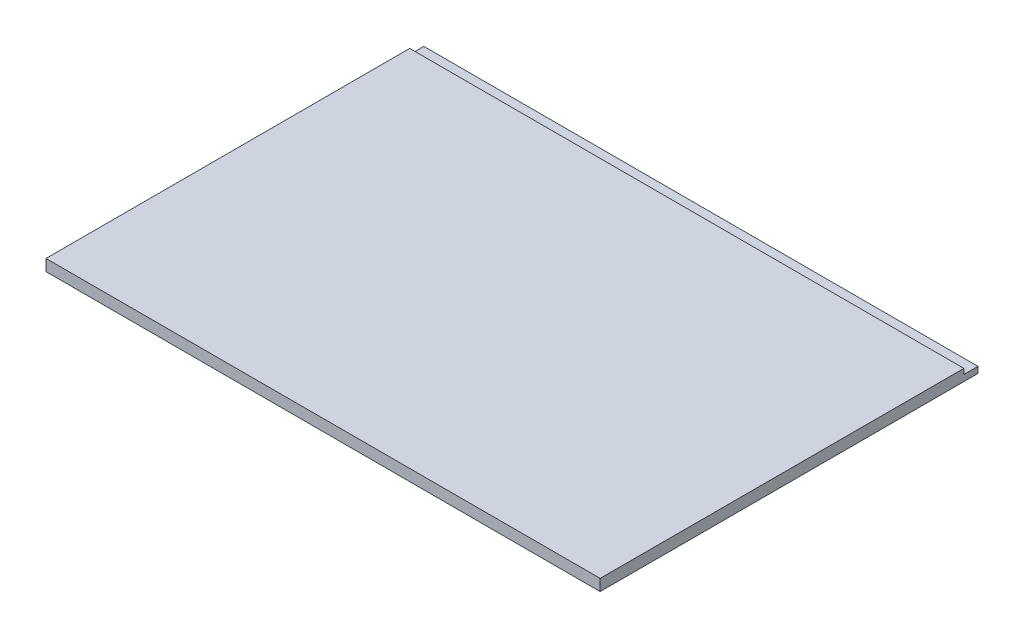
ISO-10303-21;
HEADER;
FILE_DESCRIPTION(('STEP AP214'),'2;1');
FILE_NAME('part.step','',(''),(''),'','','');
FILE_SCHEMA(('AUTOMOTIVE_DESIGN { 1 0 10303 214 1 1 1 1 }'));
ENDSEC;
DATA;
#1=APPLICATION_CONTEXT('core data for automotive mechanical design processes');
#2=APPLICATION_PROTOCOL_DEFINITION('international standard','automotive_design',2000,#1);
#3=PRODUCT_CONTEXT('',#1,'mechanical');
#4=PRODUCT('Part','Part','',(#3));
#5=PRODUCT_RELATED_PRODUCT_CATEGORY('part','',(#4));
#6=PRODUCT_DEFINITION_FORMATION('','',#4);
#7=PRODUCT_DEFINITION_CONTEXT('part definition',#1,'design');
#8=PRODUCT_DEFINITION('design','',#6,#7);
#9=PRODUCT_DEFINITION_SHAPE('','',#8);
#10=(LENGTH_UNIT() NAMED_UNIT(*) SI_UNIT(.MILLI.,.METRE.));
#11=(NAMED_UNIT(*) PLANE_ANGLE_UNIT() SI_UNIT($,.RADIAN.));
#12=(NAMED_UNIT(*) SI_UNIT($,.STERADIAN.) SOLID_ANGLE_UNIT());
#13=UNCERTAINTY_MEASURE_WITH_UNIT(LENGTH_MEASURE(1.E-05),#10,'distance_accuracy_value','');
#14=(GEOMETRIC_REPRESENTATION_CONTEXT(3) GLOBAL_UNCERTAINTY_ASSIGNED_CONTEXT((#13)) GLOBAL_UNIT_ASSIGNED_CONTEXT((#10,
#11,#12)) REPRESENTATION_CONTEXT('',''));
#15=CARTESIAN_POINT('',(0.,0.,0.));
#16=DIRECTION('',(0.,0.,1.));
#17=DIRECTION('',(1.,0.,0.));
#18=AXIS2_PLACEMENT_3D('',#15,#16,#17);
#19=CARTESIAN_POINT('',(37.68,0.64,-21.58));
#20=DIRECTION('',(0.,0.,-1.));
#21=DIRECTION('',(-1.,0.,0.));
#22=AXIS2_PLACEMENT_3D('',#19,#20,#21);
#23=PLANE('',#22);
#24=DIRECTION('',(1.,0.,0.));
#25=VECTOR('',#24,1.);
#26=CARTESIAN_POINT('',(-37.68,0.7,-21.58));
#27=LINE('',#26,#25);
#28=CARTESIAN_POINT('',(-31.4,0.7,-21.58));
#29=VERTEX_POINT('',#28);
#30=CARTESIAN_POINT('',(31.4,0.7,-21.58));
#31=VERTEX_POINT('',#30);
#32=EDGE_CURVE('E77',#29,#31,#27,.T.);
#33=ORIENTED_EDGE('',*,*,#32,.F.);
#34=DIRECTION('',(0.,1.,0.));
#35=VECTOR('',#34,1.);
#36=CARTESIAN_POINT('',(-31.4,0.64,-21.58));
#37=LINE('',#36,#35);
#38=CARTESIAN_POINT('',(-31.4,1.3,-21.58));
#39=VERTEX_POINT('',#38);
#40=EDGE_CURVE('E69',#29,#39,#37,.T.);
#41=ORIENTED_EDGE('',*,*,#40,.T.);
#42=DIRECTION('',(1.,0.,0.));
#43=VECTOR('',#42,1.);
#44=CARTESIAN_POINT('',(-37.68,1.3,-21.58));
#45=LINE('',#44,#43);
#46=CARTESIAN_POINT('',(31.4,1.3,-21.58));
#47=VERTEX_POINT('',#46);
#48=EDGE_CURVE('E84',#39,#47,#45,.T.);
#49=ORIENTED_EDGE('',*,*,#48,.T.);
#50=DIRECTION('',(0.,1.,0.));
#51=VECTOR('',#50,1.);
#52=CARTESIAN_POINT('',(31.4,0.64,-21.58));
#53=LINE('',#52,#51);
#54=EDGE_CURVE('E19',#47,#31,#53,.F.);
#55=ORIENTED_EDGE('',*,*,#54,.T.);
#56=EDGE_LOOP('',(#33,#41,#49,#55));
#57=FACE_BOUND('',#56,.T.);
#58=ADVANCED_FACE('F16',(#57),#23,.T.);
#59=CARTESIAN_POINT('',(-37.68,0.7,-23.34));
#60=DIRECTION('',(0.,1.,0.));
#61=DIRECTION('',(0.,0.,1.));
#62=AXIS2_PLACEMENT_3D('',#59,#60,#61);
#63=PLANE('',#62);
#64=DIRECTION('',(-1.,0.,0.));
#65=VECTOR('',#64,1.);
#66=CARTESIAN_POINT('',(37.68,0.7,-23.18));
#67=LINE('',#66,#65);
#68=CARTESIAN_POINT('',(-31.4,0.7,-23.18));
#69=VERTEX_POINT('',#68);
#70=CARTESIAN_POINT('',(31.4,0.7,-23.18));
#71=VERTEX_POINT('',#70);
#72=EDGE_CURVE('E82',#69,#71,#67,.F.);
#73=ORIENTED_EDGE('',*,*,#72,.F.);
#74=DIRECTION('',(0.,0.,1.));
#75=VECTOR('',#74,1.);
#76=CARTESIAN_POINT('',(-31.4,0.7,-23.34));
#77=LINE('',#76,#75);
#78=EDGE_CURVE('E72',#69,#29,#77,.T.);
#79=ORIENTED_EDGE('',*,*,#78,.T.);
#80=ORIENTED_EDGE('',*,*,#32,.T.);
#81=DIRECTION('',(0.,0.,-1.));
#82=VECTOR('',#81,1.);
#83=CARTESIAN_POINT('',(31.4,0.7,23.922));
#84=LINE('',#83,#82);
#85=EDGE_CURVE('E89',#71,#31,#84,.F.);
#86=ORIENTED_EDGE('',*,*,#85,.F.);
#87=EDGE_LOOP('',(#73,#79,#80,#86));
#88=FACE_BOUND('',#87,.T.);
#89=ADVANCED_FACE('F79',(#88),#63,.T.);
#90=CARTESIAN_POINT('',(-37.68,1.3,23.762));
#91=DIRECTION('',(0.,-1.,0.));
#92=DIRECTION('',(0.,0.,-1.));
#93=AXIS2_PLACEMENT_3D('',#90,#91,#92);
#94=PLANE('',#93);
#95=DIRECTION('',(0.,0.,-1.));
#96=VECTOR('',#95,1.);
#97=CARTESIAN_POINT('',(31.4,1.3,23.922));
#98=LINE('',#97,#96);
#99=CARTESIAN_POINT('',(31.4,1.3,19.64));
#100=VERTEX_POINT('',#99);
#101=EDGE_CURVE('E91',#47,#100,#98,.F.);
#102=ORIENTED_EDGE('',*,*,#101,.F.);
#103=ORIENTED_EDGE('',*,*,#48,.F.);
#104=DIRECTION('',(0.,0.,1.));
#105=VECTOR('',#104,1.);
#106=CARTESIAN_POINT('',(-31.4,1.3,-27.462));
#107=LINE('',#106,#105);
#108=CARTESIAN_POINT('',(-31.4,1.3,19.64));
#109=VERTEX_POINT('',#108);
#110=EDGE_CURVE('E75',#109,#39,#107,.F.);
#111=ORIENTED_EDGE('',*,*,#110,.F.);
#112=DIRECTION('',(1.,0.,0.));
#113=VECTOR('',#112,1.);
#114=CARTESIAN_POINT('',(-37.68,1.3,19.64));
#115=LINE('',#114,#113);
#116=EDGE_CURVE('E102',#100,#109,#115,.F.);
#117=ORIENTED_EDGE('',*,*,#116,.F.);
#118=EDGE_LOOP('',(#102,#103,#111,#117));
#119=FACE_BOUND('',#118,.T.);
#120=ADVANCED_FACE('F139',(#119),#94,.F.);
#121=CARTESIAN_POINT('',(31.4,-0.13,23.922));
#122=DIRECTION('',(1.,0.,0.));
#123=DIRECTION('',(0.,0.,-1.));
#124=AXIS2_PLACEMENT_3D('',#121,#122,#123);
#125=PLANE('',#124);
#126=DIRECTION('',(0.,0.,1.));
#127=VECTOR('',#126,1.);
#128=CARTESIAN_POINT('',(31.4,0.,-27.462));
#129=LINE('',#128,#127);
#130=CARTESIAN_POINT('',(31.4,0.,19.64));
#131=VERTEX_POINT('',#130);
#132=CARTESIAN_POINT('',(31.4,0.,-23.18));
#133=VERTEX_POINT('',#132);
#134=EDGE_CURVE('E105',#131,#133,#129,.F.);
#135=ORIENTED_EDGE('',*,*,#134,.T.);
#136=DIRECTION('',(0.,1.,0.));
#137=VECTOR('',#136,1.);
#138=CARTESIAN_POINT('',(31.4,-0.07,-23.18));
#139=LINE('',#138,#137);
#140=EDGE_CURVE('E94',#71,#133,#139,.F.);
#141=ORIENTED_EDGE('',*,*,#140,.F.);
#142=ORIENTED_EDGE('',*,*,#85,.T.);
#143=ORIENTED_EDGE('',*,*,#54,.F.);
#144=ORIENTED_EDGE('',*,*,#101,.T.);
#145=DIRECTION('',(0.,1.,0.));
#146=VECTOR('',#145,1.);
#147=CARTESIAN_POINT('',(31.4,-0.13,19.64));
#148=LINE('',#147,#146);
#149=EDGE_CURVE('E99',#131,#100,#148,.T.);
#150=ORIENTED_EDGE('',*,*,#149,.F.);
#151=EDGE_LOOP('',(#135,#141,#142,#143,#144,#150));
#152=FACE_BOUND('',#151,.T.);
#153=ADVANCED_FACE('F120',(#152),#125,.T.);
#154=CARTESIAN_POINT('',(37.68,-0.07,-23.18));
#155=DIRECTION('',(0.,0.,-1.));
#156=DIRECTION('',(-1.,0.,0.));
#157=AXIS2_PLACEMENT_3D('',#154,#155,#156);
#158=PLANE('',#157);
#159=DIRECTION('',(1.,0.,0.));
#160=VECTOR('',#159,1.);
#161=CARTESIAN_POINT('',(-37.68,0.,-23.18));
#162=LINE('',#161,#160);
#163=CARTESIAN_POINT('',(-31.4,0.,-23.18));
#164=VERTEX_POINT('',#163);
#165=EDGE_CURVE('E108',#133,#164,#162,.F.);
#166=ORIENTED_EDGE('',*,*,#165,.T.);
#167=DIRECTION('',(0.,1.,0.));
#168=VECTOR('',#167,1.);
#169=CARTESIAN_POINT('',(-31.4,-0.13,-23.18));
#170=LINE('',#169,#168);
#171=EDGE_CURVE('E96',#69,#164,#170,.F.);
#172=ORIENTED_EDGE('',*,*,#171,.F.);
#173=ORIENTED_EDGE('',*,*,#72,.T.);
#174=ORIENTED_EDGE('',*,*,#140,.T.);
#175=EDGE_LOOP('',(#166,#172,#173,#174));
#176=FACE_BOUND('',#175,.T.);
#177=ADVANCED_FACE('F117',(#176),#158,.T.);
#178=CARTESIAN_POINT('',(-31.4,-0.13,-27.462));
#179=DIRECTION('',(-1.,0.,0.));
#180=DIRECTION('',(0.,0.,1.));
#181=AXIS2_PLACEMENT_3D('',#178,#179,#180);
#182=PLANE('',#181);
#183=ORIENTED_EDGE('',*,*,#110,.T.);
#184=ORIENTED_EDGE('',*,*,#40,.F.);
#185=ORIENTED_EDGE('',*,*,#78,.F.);
#186=ORIENTED_EDGE('',*,*,#171,.T.);
#187=DIRECTION('',(0.,0.,1.));
#188=VECTOR('',#187,1.);
#189=CARTESIAN_POINT('',(-31.4,0.,-27.462));
#190=LINE('',#189,#188);
#191=CARTESIAN_POINT('',(-31.4,0.,19.64));
#192=VERTEX_POINT('',#191);
#193=EDGE_CURVE('E25',#164,#192,#190,.T.);
#194=ORIENTED_EDGE('',*,*,#193,.T.);
#195=DIRECTION('',(0.,1.,0.));
#196=VECTOR('',#195,1.);
#197=CARTESIAN_POINT('',(-31.4,-0.13,19.64));
#198=LINE('',#197,#196);
#199=EDGE_CURVE('E33',#109,#192,#198,.F.);
#200=ORIENTED_EDGE('',*,*,#199,.F.);
#201=EDGE_LOOP('',(#183,#184,#185,#186,#194,#200));
#202=FACE_BOUND('',#201,.T.);
#203=ADVANCED_FACE('F71',(#202),#182,.T.);
#204=CARTESIAN_POINT('',(-37.68,-0.13,19.64));
#205=DIRECTION('',(0.,0.,1.));
#206=DIRECTION('',(1.,0.,0.));
#207=AXIS2_PLACEMENT_3D('',#204,#205,#206);
#208=PLANE('',#207);
#209=ORIENTED_EDGE('',*,*,#199,.T.);
#210=DIRECTION('',(1.,0.,0.));
#211=VECTOR('',#210,1.);
#212=CARTESIAN_POINT('',(-37.68,0.,19.64));
#213=LINE('',#212,#211);
#214=EDGE_CURVE('E10',#192,#131,#213,.T.);
#215=ORIENTED_EDGE('',*,*,#214,.T.);
#216=ORIENTED_EDGE('',*,*,#149,.T.);
#217=ORIENTED_EDGE('',*,*,#116,.T.);
#218=EDGE_LOOP('',(#209,#215,#216,#217));
#219=FACE_BOUND('',#218,.T.);
#220=ADVANCED_FACE('F124',(#219),#208,.T.);
#221=CARTESIAN_POINT('',(-37.68,0.,-27.462));
#222=DIRECTION('',(0.,1.,0.));
#223=DIRECTION('',(0.,0.,1.));
#224=AXIS2_PLACEMENT_3D('',#221,#222,#223);
#225=PLANE('',#224);
#226=ORIENTED_EDGE('',*,*,#193,.F.);
#227=ORIENTED_EDGE('',*,*,#165,.F.);
#228=ORIENTED_EDGE('',*,*,#134,.F.);
#229=ORIENTED_EDGE('',*,*,#214,.F.);
#230=EDGE_LOOP('',(#226,#227,#228,#229));
#231=FACE_BOUND('',#230,.T.);
#232=ADVANCED_FACE('F115',(#231),#225,.F.);
#233=CLOSED_SHELL('',(#58,#89,#120,#153,#177,#203,#220,#232));
#234=MANIFOLD_SOLID_BREP('B1',#233);
#235=ADVANCED_BREP_SHAPE_REPRESENTATION('',(#18,#234),#14);
#236=SHAPE_DEFINITION_REPRESENTATION(#9,#235);
ENDSEC;
END-ISO-10303-21;
